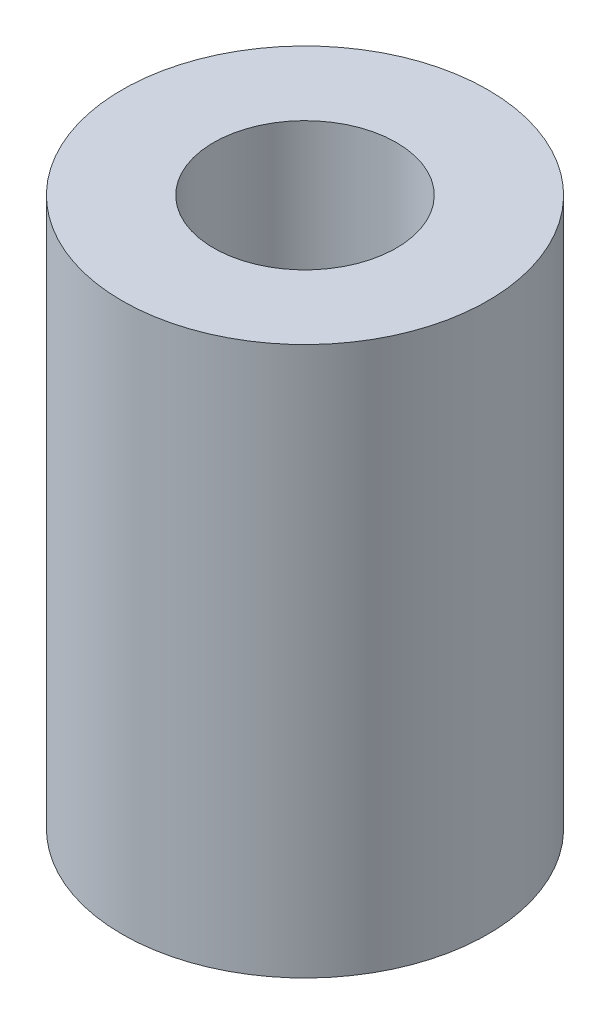
ISO-10303-21;
HEADER;
FILE_DESCRIPTION(('STEP AP214'),'2;1');
FILE_NAME('part.step','',(''),(''),'','','');
FILE_SCHEMA(('AUTOMOTIVE_DESIGN { 1 0 10303 214 1 1 1 1 }'));
ENDSEC;
DATA;
#1=APPLICATION_CONTEXT('core data for automotive mechanical design processes');
#2=APPLICATION_PROTOCOL_DEFINITION('international standard','automotive_design',2000,#1);
#3=PRODUCT_CONTEXT('',#1,'mechanical');
#4=PRODUCT('Part','Part','',(#3));
#5=PRODUCT_RELATED_PRODUCT_CATEGORY('part','',(#4));
#6=PRODUCT_DEFINITION_FORMATION('','',#4);
#7=PRODUCT_DEFINITION_CONTEXT('part definition',#1,'design');
#8=PRODUCT_DEFINITION('design','',#6,#7);
#9=PRODUCT_DEFINITION_SHAPE('','',#8);
#10=(LENGTH_UNIT() NAMED_UNIT(*) SI_UNIT(.MILLI.,.METRE.));
#11=(NAMED_UNIT(*) PLANE_ANGLE_UNIT() SI_UNIT($,.RADIAN.));
#12=(NAMED_UNIT(*) SI_UNIT($,.STERADIAN.) SOLID_ANGLE_UNIT());
#13=UNCERTAINTY_MEASURE_WITH_UNIT(LENGTH_MEASURE(1.E-05),#10,'distance_accuracy_value','');
#14=(GEOMETRIC_REPRESENTATION_CONTEXT(3) GLOBAL_UNCERTAINTY_ASSIGNED_CONTEXT((#13)) GLOBAL_UNIT_ASSIGNED_CONTEXT((#10,
#11,#12)) REPRESENTATION_CONTEXT('',''));
#15=CARTESIAN_POINT('',(0.,0.,0.));
#16=DIRECTION('',(0.,0.,1.));
#17=DIRECTION('',(1.,0.,0.));
#18=AXIS2_PLACEMENT_3D('',#15,#16,#17);
#19=CARTESIAN_POINT('',(0.,9.525,0.));
#20=DIRECTION('',(0.,1.,0.));
#21=DIRECTION('',(0.,0.,1.));
#22=AXIS2_PLACEMENT_3D('',#19,#20,#21);
#23=PLANE('',#22);
#24=CARTESIAN_POINT('',(0.,9.525,0.));
#25=DIRECTION('',(0.,1.,0.));
#26=DIRECTION('',(0.,0.,1.));
#27=AXIS2_PLACEMENT_3D('',#24,#25,#26);
#28=CIRCLE('',#27,3.175);
#29=CARTESIAN_POINT('',(0.,9.525,-3.175));
#30=VERTEX_POINT('',#29);
#31=EDGE_CURVE('E10',#30,#30,#28,.T.);
#32=ORIENTED_EDGE('',*,*,#31,.T.);
#33=EDGE_LOOP('',(#32));
#34=FACE_BOUND('',#33,.T.);
#35=CARTESIAN_POINT('',(0.,9.525,0.));
#36=DIRECTION('',(0.,1.,0.));
#37=DIRECTION('',(0.,0.,1.));
#38=AXIS2_PLACEMENT_3D('',#35,#36,#37);
#39=CIRCLE('',#38,1.5875);
#40=CARTESIAN_POINT('',(0.,9.525,-1.5875));
#41=VERTEX_POINT('',#40);
#42=EDGE_CURVE('E42',#41,#41,#39,.T.);
#43=ORIENTED_EDGE('',*,*,#42,.F.);
#44=EDGE_LOOP('',(#43));
#45=FACE_BOUND('',#44,.T.);
#46=ADVANCED_FACE('F31',(#34,#45),#23,.T.);
#47=CARTESIAN_POINT('',(0.,0.,0.));
#48=DIRECTION('',(0.,1.,0.));
#49=DIRECTION('',(0.,0.,1.));
#50=AXIS2_PLACEMENT_3D('',#47,#48,#49);
#51=PLANE('',#50);
#52=CARTESIAN_POINT('',(0.,0.,0.));
#53=DIRECTION('',(0.,1.,0.));
#54=DIRECTION('',(0.,0.,1.));
#55=AXIS2_PLACEMENT_3D('',#52,#53,#54);
#56=CIRCLE('',#55,3.175);
#57=CARTESIAN_POINT('',(0.,0.,-3.175));
#58=VERTEX_POINT('',#57);
#59=EDGE_CURVE('E35',#58,#58,#56,.T.);
#60=ORIENTED_EDGE('',*,*,#59,.F.);
#61=EDGE_LOOP('',(#60));
#62=FACE_BOUND('',#61,.T.);
#63=CARTESIAN_POINT('',(0.,0.,0.));
#64=DIRECTION('',(0.,1.,0.));
#65=DIRECTION('',(0.,0.,1.));
#66=AXIS2_PLACEMENT_3D('',#63,#64,#65);
#67=CIRCLE('',#66,1.5875);
#68=CARTESIAN_POINT('',(0.,0.,-1.5875));
#69=VERTEX_POINT('',#68);
#70=EDGE_CURVE('E44',#69,#69,#67,.T.);
#71=ORIENTED_EDGE('',*,*,#70,.T.);
#72=EDGE_LOOP('',(#71));
#73=FACE_BOUND('',#72,.T.);
#74=ADVANCED_FACE('F54',(#62,#73),#51,.F.);
#75=CARTESIAN_POINT('',(0.,9.525,0.));
#76=DIRECTION('',(0.,-1.,0.));
#77=DIRECTION('',(0.,0.,-1.));
#78=AXIS2_PLACEMENT_3D('',#75,#76,#77);
#79=CYLINDRICAL_SURFACE('',#78,3.175);
#80=CARTESIAN_POINT('',(0.,9.525,-3.175));
#81=CARTESIAN_POINT('',(0.,9.42578125,-3.175));
#82=CARTESIAN_POINT('',(0.,9.3265625,-3.175));
#83=CARTESIAN_POINT('',(0.,9.128125,-3.175));
#84=CARTESIAN_POINT('',(0.,9.02890625,-3.175));
#85=CARTESIAN_POINT('',(0.,8.83046875,-3.175));
#86=CARTESIAN_POINT('',(0.,8.73125,-3.175));
#87=CARTESIAN_POINT('',(0.,8.5328125,-3.175));
#88=CARTESIAN_POINT('',(0.,8.43359375,-3.175));
#89=CARTESIAN_POINT('',(0.,8.23515625,-3.175));
#90=CARTESIAN_POINT('',(0.,8.1359375,-3.175));
#91=CARTESIAN_POINT('',(0.,7.9375,-3.175));
#92=CARTESIAN_POINT('',(0.,7.83828125,-3.175));
#93=CARTESIAN_POINT('',(0.,7.63984375,-3.175));
#94=CARTESIAN_POINT('',(0.,7.540625,-3.175));
#95=CARTESIAN_POINT('',(0.,7.3421875,-3.175));
#96=CARTESIAN_POINT('',(0.,7.24296875,-3.175));
#97=CARTESIAN_POINT('',(0.,7.04453125,-3.175));
#98=CARTESIAN_POINT('',(0.,6.9453125,-3.175));
#99=CARTESIAN_POINT('',(0.,6.746875,-3.175));
#100=CARTESIAN_POINT('',(0.,6.64765625,-3.175));
#101=CARTESIAN_POINT('',(0.,6.44921875,-3.175));
#102=CARTESIAN_POINT('',(0.,6.35,-3.175));
#103=CARTESIAN_POINT('',(0.,6.1515625,-3.175));
#104=CARTESIAN_POINT('',(0.,6.05234375,-3.175));
#105=CARTESIAN_POINT('',(0.,5.85390625,-3.175));
#106=CARTESIAN_POINT('',(0.,5.7546875,-3.175));
#107=CARTESIAN_POINT('',(0.,5.55625,-3.175));
#108=CARTESIAN_POINT('',(0.,5.45703125,-3.175));
#109=CARTESIAN_POINT('',(0.,5.25859375,-3.175));
#110=CARTESIAN_POINT('',(0.,5.159375,-3.175));
#111=CARTESIAN_POINT('',(0.,4.9609375,-3.175));
#112=CARTESIAN_POINT('',(0.,4.86171875,-3.175));
#113=CARTESIAN_POINT('',(0.,4.66328125,-3.175));
#114=CARTESIAN_POINT('',(0.,4.5640625,-3.175));
#115=CARTESIAN_POINT('',(0.,4.365625,-3.175));
#116=CARTESIAN_POINT('',(0.,4.26640625,-3.175));
#117=CARTESIAN_POINT('',(0.,4.06796875,-3.175));
#118=CARTESIAN_POINT('',(0.,3.96875,-3.175));
#119=CARTESIAN_POINT('',(0.,3.7703125,-3.175));
#120=CARTESIAN_POINT('',(0.,3.67109375,-3.175));
#121=CARTESIAN_POINT('',(0.,3.47265625,-3.175));
#122=CARTESIAN_POINT('',(0.,3.3734375,-3.175));
#123=CARTESIAN_POINT('',(0.,3.175,-3.175));
#124=CARTESIAN_POINT('',(0.,3.07578125,-3.175));
#125=CARTESIAN_POINT('',(0.,2.87734375,-3.175));
#126=CARTESIAN_POINT('',(0.,2.778125,-3.175));
#127=CARTESIAN_POINT('',(0.,2.5796875,-3.175));
#128=CARTESIAN_POINT('',(0.,2.48046875,-3.175));
#129=CARTESIAN_POINT('',(0.,2.28203125,-3.175));
#130=CARTESIAN_POINT('',(0.,2.1828125,-3.175));
#131=CARTESIAN_POINT('',(0.,1.984375,-3.175));
#132=CARTESIAN_POINT('',(0.,1.88515625,-3.175));
#133=CARTESIAN_POINT('',(0.,1.68671875,-3.175));
#134=CARTESIAN_POINT('',(0.,1.5875,-3.175));
#135=CARTESIAN_POINT('',(0.,1.3890625,-3.175));
#136=CARTESIAN_POINT('',(0.,1.28984375,-3.175));
#137=CARTESIAN_POINT('',(0.,1.09140625,-3.175));
#138=CARTESIAN_POINT('',(0.,0.992187500000001,-3.175));
#139=CARTESIAN_POINT('',(0.,0.793750000000001,-3.175));
#140=CARTESIAN_POINT('',(0.,0.69453125,-3.175));
#141=CARTESIAN_POINT('',(0.,0.49609375,-3.175));
#142=CARTESIAN_POINT('',(0.,0.396875,-3.175));
#143=CARTESIAN_POINT('',(0.,0.1984375,-3.175));
#144=CARTESIAN_POINT('',(0.,0.0992187500000001,-3.175));
#145=CARTESIAN_POINT('',(0.,0.,-3.175));
#146=B_SPLINE_CURVE_WITH_KNOTS('',3,(#80,#81,#82,#83,#84,#85,#86,#87,#88,#89,#90,#91,#92,#93,
#94,#95,#96,#97,#98,#99,#100,#101,#102,#103,#104,#105,#106,#107,#108,#109,#110,#111,#112,#113,
#114,#115,#116,#117,#118,#119,#120,#121,#122,#123,#124,#125,#126,#127,#128,#129,#130,#131,#132,
#133,#134,#135,#136,#137,#138,#139,#140,#141,#142,#143,#144,#145),.UNSPECIFIED.,.F.,.F.,(4,2,2,
2,2,2,2,2,2,2,2,2,2,2,2,2,2,2,2,2,2,2,2,2,2,2,2,2,2,2,2,2,4),(0.,0.29765625,0.5953125,
0.892968750000001,1.190625,1.48828125,1.7859375,2.08359375,2.38125,2.67890625,2.9765625,
3.27421875,3.571875,3.86953125,4.1671875,4.46484375,4.7625,5.06015625,5.3578125,5.65546875,
5.953125,6.25078125,6.5484375,6.84609375,7.14375,7.44140625,7.7390625,8.03671875,8.334375,
8.63203125,8.9296875,9.22734375,9.525),.UNSPECIFIED.);
#147=EDGE_CURVE('BSEAM33',#30,#58,#146,.T.);
#148=ORIENTED_EDGE('',*,*,#31,.F.);
#149=ORIENTED_EDGE('',*,*,#59,.T.);
#150=ORIENTED_EDGE('',*,*,#147,.T.);
#151=ORIENTED_EDGE('',*,*,#147,.F.);
#152=EDGE_LOOP('',(#148,#150,#149,#151));
#153=FACE_BOUND('',#152,.T.);
#154=ADVANCED_FACE('F33',(#153),#79,.T.);
#155=CARTESIAN_POINT('',(0.,9.525,0.));
#156=DIRECTION('',(0.,-1.,0.));
#157=DIRECTION('',(0.,0.,-1.));
#158=AXIS2_PLACEMENT_3D('',#155,#156,#157);
#159=CYLINDRICAL_SURFACE('',#158,1.5875);
#160=CARTESIAN_POINT('',(0.,9.525,-1.5875));
#161=CARTESIAN_POINT('',(0.,9.42578125,-1.5875));
#162=CARTESIAN_POINT('',(0.,9.3265625,-1.5875));
#163=CARTESIAN_POINT('',(0.,9.128125,-1.5875));
#164=CARTESIAN_POINT('',(0.,9.02890625,-1.5875));
#165=CARTESIAN_POINT('',(0.,8.83046875,-1.5875));
#166=CARTESIAN_POINT('',(0.,8.73125,-1.5875));
#167=CARTESIAN_POINT('',(0.,8.5328125,-1.5875));
#168=CARTESIAN_POINT('',(0.,8.43359375,-1.5875));
#169=CARTESIAN_POINT('',(0.,8.23515625,-1.5875));
#170=CARTESIAN_POINT('',(0.,8.1359375,-1.5875));
#171=CARTESIAN_POINT('',(0.,7.9375,-1.5875));
#172=CARTESIAN_POINT('',(0.,7.83828125,-1.5875));
#173=CARTESIAN_POINT('',(0.,7.63984375,-1.5875));
#174=CARTESIAN_POINT('',(0.,7.540625,-1.5875));
#175=CARTESIAN_POINT('',(0.,7.3421875,-1.5875));
#176=CARTESIAN_POINT('',(0.,7.24296875,-1.5875));
#177=CARTESIAN_POINT('',(0.,7.04453125,-1.5875));
#178=CARTESIAN_POINT('',(0.,6.9453125,-1.5875));
#179=CARTESIAN_POINT('',(0.,6.746875,-1.5875));
#180=CARTESIAN_POINT('',(0.,6.64765625,-1.5875));
#181=CARTESIAN_POINT('',(0.,6.44921875,-1.5875));
#182=CARTESIAN_POINT('',(0.,6.35,-1.5875));
#183=CARTESIAN_POINT('',(0.,6.1515625,-1.5875));
#184=CARTESIAN_POINT('',(0.,6.05234375,-1.5875));
#185=CARTESIAN_POINT('',(0.,5.85390625,-1.5875));
#186=CARTESIAN_POINT('',(0.,5.7546875,-1.5875));
#187=CARTESIAN_POINT('',(0.,5.55625,-1.5875));
#188=CARTESIAN_POINT('',(0.,5.45703125,-1.5875));
#189=CARTESIAN_POINT('',(0.,5.25859375,-1.5875));
#190=CARTESIAN_POINT('',(0.,5.159375,-1.5875));
#191=CARTESIAN_POINT('',(0.,4.9609375,-1.5875));
#192=CARTESIAN_POINT('',(0.,4.86171875,-1.5875));
#193=CARTESIAN_POINT('',(0.,4.66328125,-1.5875));
#194=CARTESIAN_POINT('',(0.,4.5640625,-1.5875));
#195=CARTESIAN_POINT('',(0.,4.365625,-1.5875));
#196=CARTESIAN_POINT('',(0.,4.26640625,-1.5875));
#197=CARTESIAN_POINT('',(0.,4.06796875,-1.5875));
#198=CARTESIAN_POINT('',(0.,3.96875,-1.5875));
#199=CARTESIAN_POINT('',(0.,3.7703125,-1.5875));
#200=CARTESIAN_POINT('',(0.,3.67109375,-1.5875));
#201=CARTESIAN_POINT('',(0.,3.47265625,-1.5875));
#202=CARTESIAN_POINT('',(0.,3.3734375,-1.5875));
#203=CARTESIAN_POINT('',(0.,3.175,-1.5875));
#204=CARTESIAN_POINT('',(0.,3.07578125,-1.5875));
#205=CARTESIAN_POINT('',(0.,2.87734375,-1.5875));
#206=CARTESIAN_POINT('',(0.,2.778125,-1.5875));
#207=CARTESIAN_POINT('',(0.,2.5796875,-1.5875));
#208=CARTESIAN_POINT('',(0.,2.48046875,-1.5875));
#209=CARTESIAN_POINT('',(0.,2.28203125,-1.5875));
#210=CARTESIAN_POINT('',(0.,2.1828125,-1.5875));
#211=CARTESIAN_POINT('',(0.,1.984375,-1.5875));
#212=CARTESIAN_POINT('',(0.,1.88515625,-1.5875));
#213=CARTESIAN_POINT('',(0.,1.68671875,-1.5875));
#214=CARTESIAN_POINT('',(0.,1.5875,-1.5875));
#215=CARTESIAN_POINT('',(0.,1.3890625,-1.5875));
#216=CARTESIAN_POINT('',(0.,1.28984375,-1.5875));
#217=CARTESIAN_POINT('',(0.,1.09140625,-1.5875));
#218=CARTESIAN_POINT('',(0.,0.992187500000001,-1.5875));
#219=CARTESIAN_POINT('',(0.,0.793750000000001,-1.5875));
#220=CARTESIAN_POINT('',(0.,0.69453125,-1.5875));
#221=CARTESIAN_POINT('',(0.,0.49609375,-1.5875));
#222=CARTESIAN_POINT('',(0.,0.396875,-1.5875));
#223=CARTESIAN_POINT('',(0.,0.1984375,-1.5875));
#224=CARTESIAN_POINT('',(0.,0.0992187500000001,-1.5875));
#225=CARTESIAN_POINT('',(0.,0.,-1.5875));
#226=B_SPLINE_CURVE_WITH_KNOTS('',3,(#160,#161,#162,#163,#164,#165,#166,#167,#168,#169,#170,
#171,#172,#173,#174,#175,#176,#177,#178,#179,#180,#181,#182,#183,#184,#185,#186,#187,#188,#189,
#190,#191,#192,#193,#194,#195,#196,#197,#198,#199,#200,#201,#202,#203,#204,#205,#206,#207,#208,
#209,#210,#211,#212,#213,#214,#215,#216,#217,#218,#219,#220,#221,#222,#223,#224,#225),
.UNSPECIFIED.,.F.,.F.,(4,2,2,2,2,2,2,2,2,2,2,2,2,2,2,2,2,2,2,2,2,2,2,2,2,2,2,2,2,2,2,2,4),(0.,
0.297656249999998,0.595312499999999,0.892968749999999,1.190625,1.48828125,1.7859375,2.08359375,
2.38125,2.67890625,2.9765625,3.27421875,3.571875,3.86953125,4.1671875,4.46484375,4.7625,
5.06015625,5.3578125,5.65546875,5.953125,6.25078125,6.5484375,6.84609375,7.14375,7.44140625,
7.7390625,8.03671875,8.334375,8.63203125,8.9296875,9.22734375,9.525),.UNSPECIFIED.);
#227=EDGE_CURVE('BSEAM50',#41,#69,#226,.T.);
#228=ORIENTED_EDGE('',*,*,#42,.T.);
#229=ORIENTED_EDGE('',*,*,#70,.F.);
#230=ORIENTED_EDGE('',*,*,#227,.T.);
#231=ORIENTED_EDGE('',*,*,#227,.F.);
#232=EDGE_LOOP('',(#228,#230,#229,#231));
#233=FACE_BOUND('',#232,.T.);
#234=ADVANCED_FACE('F50',(#233),#159,.F.);
#235=CLOSED_SHELL('',(#46,#74,#154,#234));
#236=MANIFOLD_SOLID_BREP('B2',#235);
#237=ADVANCED_BREP_SHAPE_REPRESENTATION('',(#18,#236),#14);
#238=SHAPE_DEFINITION_REPRESENTATION(#9,#237);
ENDSEC;
END-ISO-10303-21;
